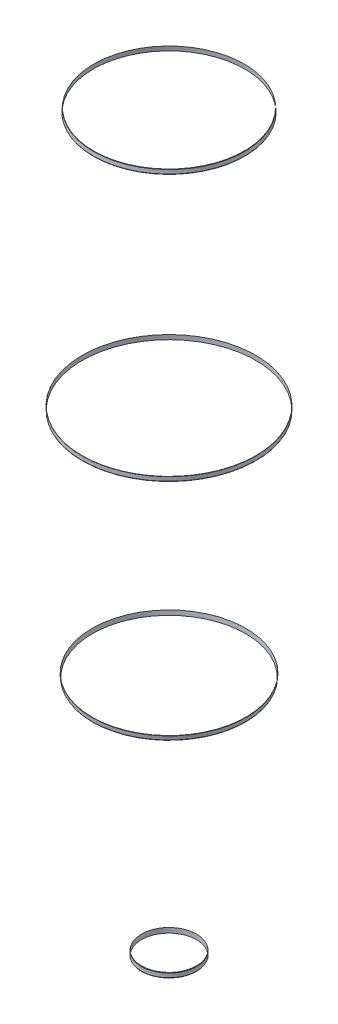
ISO-10303-21;
HEADER;
FILE_DESCRIPTION(('STEP AP214'),'2;1');
FILE_NAME('part.step','',(''),(''),'','','');
FILE_SCHEMA(('AUTOMOTIVE_DESIGN { 1 0 10303 214 1 1 1 1 }'));
ENDSEC;
DATA;
#1=APPLICATION_CONTEXT('core data for automotive mechanical design processes');
#2=APPLICATION_PROTOCOL_DEFINITION('international standard','automotive_design',2000,#1);
#3=PRODUCT_CONTEXT('',#1,'mechanical');
#4=PRODUCT('Part','Part','',(#3));
#5=PRODUCT_RELATED_PRODUCT_CATEGORY('part','',(#4));
#6=PRODUCT_DEFINITION_FORMATION('','',#4);
#7=PRODUCT_DEFINITION_CONTEXT('part definition',#1,'design');
#8=PRODUCT_DEFINITION('design','',#6,#7);
#9=PRODUCT_DEFINITION_SHAPE('','',#8);
#10=(LENGTH_UNIT() NAMED_UNIT(*) SI_UNIT(.MILLI.,.METRE.));
#11=(NAMED_UNIT(*) PLANE_ANGLE_UNIT() SI_UNIT($,.RADIAN.));
#12=(NAMED_UNIT(*) SI_UNIT($,.STERADIAN.) SOLID_ANGLE_UNIT());
#13=UNCERTAINTY_MEASURE_WITH_UNIT(LENGTH_MEASURE(1.E-05),#10,'distance_accuracy_value','');
#14=(GEOMETRIC_REPRESENTATION_CONTEXT(3) GLOBAL_UNCERTAINTY_ASSIGNED_CONTEXT((#13)) GLOBAL_UNIT_ASSIGNED_CONTEXT((#10,
#11,#12)) REPRESENTATION_CONTEXT('',''));
#15=CARTESIAN_POINT('',(0.,0.,0.));
#16=DIRECTION('',(0.,0.,1.));
#17=DIRECTION('',(1.,0.,0.));
#18=AXIS2_PLACEMENT_3D('',#15,#16,#17);
#19=CARTESIAN_POINT('',(0.,1564.70929603,0.));
#20=DIRECTION('',(0.,1.,0.));
#21=DIRECTION('',(0.,0.,1.));
#22=AXIS2_PLACEMENT_3D('',#19,#20,#21);
#23=CYLINDRICAL_SURFACE('',#22,195.47884557);
#24=CARTESIAN_POINT('',(0.,1800.72295152003,0.));
#25=DIRECTION('',(0.,1.,0.));
#26=DIRECTION('',(0.479425538604204,0.,0.877582561890372));
#27=AXIS2_PLACEMENT_3D('',#24,#25,#26);
#28=CIRCLE('',#27,195.478845570266);
#29=CARTESIAN_POINT('',(93.7175508232526,1800.72295152003,171.548826090926));
#30=VERTEX_POINT('',#29);
#31=EDGE_CURVE('P0_E26',#30,#30,#28,.F.);
#32=ORIENTED_EDGE('',*,*,#31,.F.);
#33=EDGE_LOOP('',(#32));
#34=FACE_BOUND('',#33,.T.);
#35=CARTESIAN_POINT('',(0.,1809.67374612871,0.));
#36=DIRECTION('',(0.,-1.,0.));
#37=DIRECTION('',(0.479425538604204,0.,0.877582561890373));
#38=AXIS2_PLACEMENT_3D('',#35,#36,#37);
#39=CIRCLE('',#38,195.478845567772);
#40=CARTESIAN_POINT('',(93.7175508220568,1809.67374612871,171.548826088737));
#41=VERTEX_POINT('',#40);
#42=EDGE_CURVE('P0_E17',#41,#41,#39,.F.);
#43=ORIENTED_EDGE('',*,*,#42,.F.);
#44=EDGE_LOOP('',(#43));
#45=FACE_BOUND('',#44,.T.);
#46=ADVANCED_FACE('P0_F14',(#34,#45),#23,.T.);
#47=CARTESIAN_POINT('',(0.,1809.67374612871,0.));
#48=DIRECTION('',(0.,-1.,0.));
#49=DIRECTION('',(1.,0.,0.));
#50=AXIS2_PLACEMENT_3D('',#47,#48,#49);
#51=CONICAL_SURFACE('',#50,195.478845567772,0.464025289864028);
#52=ORIENTED_EDGE('',*,*,#42,.T.);
#53=EDGE_LOOP('',(#52));
#54=FACE_BOUND('',#53,.T.);
#55=CARTESIAN_POINT('',(0.,1810.11453269,0.));
#56=DIRECTION('',(0.,1.,0.));
#57=DIRECTION('',(0.,0.,1.));
#58=AXIS2_PLACEMENT_3D('',#55,#56,#57);
#59=CIRCLE('',#58,195.258244152);
#60=CARTESIAN_POINT('',(0.,1810.11453269,195.258244152));
#61=VERTEX_POINT('',#60);
#62=EDGE_CURVE('P0_E21',#61,#61,#59,.F.);
#63=ORIENTED_EDGE('',*,*,#62,.T.);
#64=EDGE_LOOP('',(#63));
#65=FACE_BOUND('',#64,.T.);
#66=ADVANCED_FACE('P0_F34',(#54,#65),#51,.T.);
#67=CARTESIAN_POINT('',(0.,1800.72295152003,0.));
#68=DIRECTION('',(0.,1.,0.));
#69=DIRECTION('',(-1.,0.,0.));
#70=AXIS2_PLACEMENT_3D('',#67,#68,#69);
#71=CONICAL_SURFACE('',#70,195.478845570266,0.318062928618002);
#72=CARTESIAN_POINT('',(0.,1800.05292127,0.));
#73=DIRECTION('',(0.,1.,0.));
#74=DIRECTION('',(0.,0.,1.));
#75=AXIS2_PLACEMENT_3D('',#72,#73,#74);
#76=CIRCLE('',#75,195.258244152);
#77=CARTESIAN_POINT('',(0.,1800.05292127,195.258244152));
#78=VERTEX_POINT('',#77);
#79=EDGE_CURVE('P0_E10',#78,#78,#76,.T.);
#80=ORIENTED_EDGE('',*,*,#79,.T.);
#81=EDGE_LOOP('',(#80));
#82=FACE_BOUND('',#81,.T.);
#83=ORIENTED_EDGE('',*,*,#31,.T.);
#84=EDGE_LOOP('',(#83));
#85=FACE_BOUND('',#84,.T.);
#86=ADVANCED_FACE('P0_F43',(#82,#85),#71,.T.);
#87=CARTESIAN_POINT('',(0.,1564.70929603,0.));
#88=DIRECTION('',(0.,1.,0.));
#89=DIRECTION('',(0.,0.,1.));
#90=AXIS2_PLACEMENT_3D('',#87,#88,#89);
#91=CYLINDRICAL_SURFACE('',#90,195.258244152);
#92=ORIENTED_EDGE('',*,*,#62,.F.);
#93=EDGE_LOOP('',(#92));
#94=FACE_BOUND('',#93,.T.);
#95=ORIENTED_EDGE('',*,*,#79,.F.);
#96=EDGE_LOOP('',(#95));
#97=FACE_BOUND('',#96,.T.);
#98=ADVANCED_FACE('P0_F44',(#94,#97),#91,.F.);
#99=CLOSED_SHELL('',(#46,#66,#86,#98));
#100=MANIFOLD_SOLID_BREP('P0_B1',#99);
#101=CARTESIAN_POINT('',(0.,2380.71004669998,0.));
#102=DIRECTION('',(0.,-1.,0.));
#103=DIRECTION('',(0.,0.,-1.));
#104=AXIS2_PLACEMENT_3D('',#101,#102,#103);
#105=CONICAL_SURFACE('',#104,170.288715884349,0.0736089865628028);
#106=CARTESIAN_POINT('',(0.,2380.71004670009,0.));
#107=DIRECTION('',(0.,1.,0.));
#108=DIRECTION('',(0.479425538604204,0.,0.877582561890372));
#109=AXIS2_PLACEMENT_3D('',#106,#107,#108);
#110=CIRCLE('',#109,170.288715884334);
#111=CARTESIAN_POINT('',(81.6407593310648,2380.71004670009,149.442407546795));
#112=VERTEX_POINT('',#111);
#113=EDGE_CURVE('P1_E26',#112,#112,#110,.F.);
#114=ORIENTED_EDGE('',*,*,#113,.F.);
#115=EDGE_LOOP('',(#114));
#116=FACE_BOUND('',#115,.T.);
#117=CARTESIAN_POINT('',(0.,2389.1305474995,0.));
#118=DIRECTION('',(0.,-1.,0.));
#119=DIRECTION('',(0.479425538604203,0.,0.877582561890373));
#120=AXIS2_PLACEMENT_3D('',#117,#118,#119);
#121=CIRCLE('',#120,169.66776945998);
#122=CARTESIAN_POINT('',(81.3430617571246,2389.1305474995,148.897475792914));
#123=VERTEX_POINT('',#122);
#124=EDGE_CURVE('P1_E17',#123,#123,#121,.F.);
#125=ORIENTED_EDGE('',*,*,#124,.F.);
#126=EDGE_LOOP('',(#125));
#127=FACE_BOUND('',#126,.T.);
#128=ADVANCED_FACE('P1_F14',(#116,#127),#105,.T.);
#129=CARTESIAN_POINT('',(0.,2389.1305474995,0.));
#130=DIRECTION('',(0.,-1.,0.));
#131=DIRECTION('',(0.,0.,-1.));
#132=AXIS2_PLACEMENT_3D('',#129,#130,#131);
#133=CONICAL_SURFACE('',#132,169.66776945998,0.372822856065);
#134=ORIENTED_EDGE('',*,*,#124,.T.);
#135=EDGE_LOOP('',(#134));
#136=FACE_BOUND('',#135,.T.);
#137=CARTESIAN_POINT('',(0.,2390.02569629996,0.));
#138=DIRECTION('',(0.,-1.,0.));
#139=DIRECTION('',(0.479425538604203,0.,0.877582561890373));
#140=AXIS2_PLACEMENT_3D('',#137,#138,#139);
#141=CIRCLE('',#140,169.317664008003);
#142=CARTESIAN_POINT('',(81.1752122622423,2390.02569629996,148.590229353436));
#143=VERTEX_POINT('',#142);
#144=EDGE_CURVE('P1_E21',#143,#143,#141,.T.);
#145=ORIENTED_EDGE('',*,*,#144,.T.);
#146=EDGE_LOOP('',(#145));
#147=FACE_BOUND('',#146,.T.);
#148=ADVANCED_FACE('P1_F34',(#136,#147),#133,.T.);
#149=CARTESIAN_POINT('',(0.,2380.71004670009,0.));
#150=DIRECTION('',(0.,1.,0.));
#151=DIRECTION('',(0.,0.,1.));
#152=AXIS2_PLACEMENT_3D('',#149,#150,#151);
#153=CONICAL_SURFACE('',#152,170.288715884334,0.304332282663018);
#154=CARTESIAN_POINT('',(0.,2379.97752486,0.));
#155=DIRECTION('',(0.,-1.,0.));
#156=DIRECTION('',(0.479425538604203,0.,0.877582561890373));
#157=AXIS2_PLACEMENT_3D('',#154,#155,#156);
#158=CIRCLE('',#157,170.058638477933);
#159=CARTESIAN_POINT('',(81.5304543465805,2379.97752486,149.240495627053));
#160=VERTEX_POINT('',#159);
#161=EDGE_CURVE('P1_E10',#160,#160,#158,.F.);
#162=ORIENTED_EDGE('',*,*,#161,.T.);
#163=EDGE_LOOP('',(#162));
#164=FACE_BOUND('',#163,.T.);
#165=ORIENTED_EDGE('',*,*,#113,.T.);
#166=EDGE_LOOP('',(#165));
#167=FACE_BOUND('',#166,.T.);
#168=ADVANCED_FACE('P1_F43',(#164,#167),#153,.T.);
#169=CARTESIAN_POINT('',(0.,2379.97752486,0.));
#170=DIRECTION('',(0.,-1.,0.));
#171=DIRECTION('',(0.,0.,-1.));
#172=AXIS2_PLACEMENT_3D('',#169,#170,#171);
#173=CONICAL_SURFACE('',#172,170.058638477933,0.0736089865628016);
#174=ORIENTED_EDGE('',*,*,#144,.F.);
#175=EDGE_LOOP('',(#174));
#176=FACE_BOUND('',#175,.T.);
#177=ORIENTED_EDGE('',*,*,#161,.F.);
#178=EDGE_LOOP('',(#177));
#179=FACE_BOUND('',#178,.T.);
#180=ADVANCED_FACE('P1_F44',(#176,#179),#173,.F.);
#181=CLOSED_SHELL('',(#128,#148,#168,#180));
#182=MANIFOLD_SOLID_BREP('P1_B1',#181);
#183=CARTESIAN_POINT('',(0.,1564.70929603,0.));
#184=DIRECTION('',(0.,1.,0.));
#185=DIRECTION('',(0.,0.,1.));
#186=AXIS2_PLACEMENT_3D('',#183,#184,#185);
#187=CYLINDRICAL_SURFACE('',#186,62.1620782758);
#188=CARTESIAN_POINT('',(0.,740.23459434584,0.));
#189=DIRECTION('',(0.,1.,0.));
#190=DIRECTION('',(0.479425538604204,0.,0.877582561890372));
#191=AXIS2_PLACEMENT_3D('',#188,#189,#190);
#192=CIRCLE('',#191,62.1620782761676);
#193=CARTESIAN_POINT('',(29.8020878583083,740.23459434584,54.552355906029));
#194=VERTEX_POINT('',#193);
#195=EDGE_CURVE('P2_E26',#194,#194,#192,.F.);
#196=ORIENTED_EDGE('',*,*,#195,.F.);
#197=EDGE_LOOP('',(#196));
#198=FACE_BOUND('',#197,.T.);
#199=CARTESIAN_POINT('',(0.,749.108251413947,0.));
#200=DIRECTION('',(0.,-1.,0.));
#201=DIRECTION('',(0.479425538604204,0.,0.877582561890372));
#202=AXIS2_PLACEMENT_3D('',#199,#200,#201);
#203=CIRCLE('',#202,62.1620782756514);
#204=CARTESIAN_POINT('',(29.8020878580608,749.108251413947,54.552355905576));
#205=VERTEX_POINT('',#204);
#206=EDGE_CURVE('P2_E17',#205,#205,#203,.F.);
#207=ORIENTED_EDGE('',*,*,#206,.F.);
#208=EDGE_LOOP('',(#207));
#209=FACE_BOUND('',#208,.T.);
#210=ADVANCED_FACE('P2_F14',(#198,#209),#187,.T.);
#211=CARTESIAN_POINT('',(0.,749.108251413947,0.));
#212=DIRECTION('',(0.,-1.,0.));
#213=DIRECTION('',(0.,0.,-1.));
#214=AXIS2_PLACEMENT_3D('',#211,#212,#213);
#215=CONICAL_SURFACE('',#214,62.1620782756514,0.292028530966002);
#216=ORIENTED_EDGE('',*,*,#206,.T.);
#217=EDGE_LOOP('',(#216));
#218=FACE_BOUND('',#217,.T.);
#219=CARTESIAN_POINT('',(0.,750.420042309,0.));
#220=DIRECTION('',(0.,1.,0.));
#221=DIRECTION('',(0.,0.,1.));
#222=AXIS2_PLACEMENT_3D('',#219,#220,#221);
#223=CIRCLE('',#222,61.7677233682);
#224=CARTESIAN_POINT('',(0.,750.420042309,61.7677233682));
#225=VERTEX_POINT('',#224);
#226=EDGE_CURVE('P2_E21',#225,#225,#223,.F.);
#227=ORIENTED_EDGE('',*,*,#226,.T.);
#228=EDGE_LOOP('',(#227));
#229=FACE_BOUND('',#228,.T.);
#230=ADVANCED_FACE('P2_F34',(#218,#229),#215,.T.);
#231=CARTESIAN_POINT('',(0.,740.23459434584,0.));
#232=DIRECTION('',(0.,1.,0.));
#233=DIRECTION('',(0.,0.,1.));
#234=AXIS2_PLACEMENT_3D('',#231,#232,#233);
#235=CONICAL_SURFACE('',#234,62.1620782761676,0.438150200270006);
#236=CARTESIAN_POINT('',(0.,739.392895752,0.));
#237=DIRECTION('',(0.,1.,0.));
#238=DIRECTION('',(0.,0.,1.));
#239=AXIS2_PLACEMENT_3D('',#236,#237,#238);
#240=CIRCLE('',#239,61.7677233682);
#241=CARTESIAN_POINT('',(0.,739.392895752,61.7677233682));
#242=VERTEX_POINT('',#241);
#243=EDGE_CURVE('P2_E10',#242,#242,#240,.T.);
#244=ORIENTED_EDGE('',*,*,#243,.T.);
#245=EDGE_LOOP('',(#244));
#246=FACE_BOUND('',#245,.T.);
#247=ORIENTED_EDGE('',*,*,#195,.T.);
#248=EDGE_LOOP('',(#247));
#249=FACE_BOUND('',#248,.T.);
#250=ADVANCED_FACE('P2_F43',(#246,#249),#235,.T.);
#251=CARTESIAN_POINT('',(0.,1564.70929603,0.));
#252=DIRECTION('',(0.,1.,0.));
#253=DIRECTION('',(0.,0.,1.));
#254=AXIS2_PLACEMENT_3D('',#251,#252,#253);
#255=CYLINDRICAL_SURFACE('',#254,61.7677233682);
#256=ORIENTED_EDGE('',*,*,#226,.F.);
#257=EDGE_LOOP('',(#256));
#258=FACE_BOUND('',#257,.T.);
#259=ORIENTED_EDGE('',*,*,#243,.F.);
#260=EDGE_LOOP('',(#259));
#261=FACE_BOUND('',#260,.T.);
#262=ADVANCED_FACE('P2_F44',(#258,#261),#255,.F.);
#263=CLOSED_SHELL('',(#210,#230,#250,#262));
#264=MANIFOLD_SOLID_BREP('P2_B1',#263);
#265=CARTESIAN_POINT('',(0.,1289.29518328998,0.));
#266=DIRECTION('',(0.,1.,0.));
#267=DIRECTION('',(-1.,0.,0.));
#268=AXIS2_PLACEMENT_3D('',#265,#266,#267);
#269=CONICAL_SURFACE('',#268,173.185467507116,0.079922365697401);
#270=CARTESIAN_POINT('',(0.,1280.76096079908,0.));
#271=DIRECTION('',(0.,1.,0.));
#272=DIRECTION('',(0.479425538604204,0.,0.877582561890372));
#273=AXIS2_PLACEMENT_3D('',#270,#271,#272);
#274=CIRCLE('',#273,172.501936266325);
#275=CARTESIAN_POINT('',(82.7018337047509,1280.76096079908,151.384691159651));
#276=VERTEX_POINT('',#275);
#277=EDGE_CURVE('P3_E26',#276,#276,#274,.F.);
#278=ORIENTED_EDGE('',*,*,#277,.F.);
#279=EDGE_LOOP('',(#278));
#280=FACE_BOUND('',#279,.T.);
#281=CARTESIAN_POINT('',(0.,1289.29518328963,0.));
#282=DIRECTION('',(0.,-1.,0.));
#283=DIRECTION('',(0.479425538604204,0.,0.877582561890372));
#284=AXIS2_PLACEMENT_3D('',#281,#282,#283);
#285=CIRCLE('',#284,173.18546750614);
#286=CARTESIAN_POINT('',(83.0295360375519,1289.29518328963,151.98454625622));
#287=VERTEX_POINT('',#286);
#288=EDGE_CURVE('P3_E17',#287,#287,#285,.F.);
#289=ORIENTED_EDGE('',*,*,#288,.F.);
#290=EDGE_LOOP('',(#289));
#291=FACE_BOUND('',#290,.T.);
#292=ADVANCED_FACE('P3_F14',(#280,#291),#269,.T.);
#293=CARTESIAN_POINT('',(0.,1289.29518328963,0.));
#294=DIRECTION('',(0.,-1.,0.));
#295=DIRECTION('',(0.,0.,-1.));
#296=AXIS2_PLACEMENT_3D('',#293,#294,#295);
#297=CONICAL_SURFACE('',#296,173.18546750614,0.454441841703013);
#298=ORIENTED_EDGE('',*,*,#288,.T.);
#299=EDGE_LOOP('',(#298));
#300=FACE_BOUND('',#299,.T.);
#301=CARTESIAN_POINT('',(0.,1289.91194275994,0.));
#302=DIRECTION('',(0.,1.,0.));
#303=DIRECTION('',(0.479425538604204,0.,0.877582561890372));
#304=AXIS2_PLACEMENT_3D('',#301,#302,#303);
#305=CIRCLE('',#304,172.884152632733);
#306=CARTESIAN_POINT('',(82.8850779920793,1289.91194275994,151.72011757768));
#307=VERTEX_POINT('',#306);
#308=EDGE_CURVE('P3_E21',#307,#307,#305,.F.);
#309=ORIENTED_EDGE('',*,*,#308,.T.);
#310=EDGE_LOOP('',(#309));
#311=FACE_BOUND('',#310,.T.);
#312=ADVANCED_FACE('P3_F34',(#300,#311),#297,.T.);
#313=CARTESIAN_POINT('',(0.,1280.76096079908,0.));
#314=DIRECTION('',(0.,1.,0.));
#315=DIRECTION('',(-1.,0.,0.));
#316=AXIS2_PLACEMENT_3D('',#313,#314,#315);
#317=CONICAL_SURFACE('',#316,172.501936266325,0.468785224273983);
#318=CARTESIAN_POINT('',(0.,1279.93835833997,0.));
#319=DIRECTION('',(0.,1.,0.));
#320=DIRECTION('',(0.479425538604204,0.,0.877582561890373));
#321=AXIS2_PLACEMENT_3D('',#318,#319,#320);
#322=CIRCLE('',#321,172.085338615998);
#323=CARTESIAN_POINT('',(82.5021061518615,1279.93835833997,151.0190923264));
#324=VERTEX_POINT('',#323);
#325=EDGE_CURVE('P3_E10',#324,#324,#322,.T.);
#326=ORIENTED_EDGE('',*,*,#325,.T.);
#327=EDGE_LOOP('',(#326));
#328=FACE_BOUND('',#327,.T.);
#329=ORIENTED_EDGE('',*,*,#277,.T.);
#330=EDGE_LOOP('',(#329));
#331=FACE_BOUND('',#330,.T.);
#332=ADVANCED_FACE('P3_F43',(#328,#331),#317,.T.);
#333=CARTESIAN_POINT('',(0.,1289.91194275994,0.));
#334=DIRECTION('',(0.,1.,0.));
#335=DIRECTION('',(0.,0.,1.));
#336=AXIS2_PLACEMENT_3D('',#333,#334,#335);
#337=CONICAL_SURFACE('',#336,172.884152632733,0.0799223656974002);
#338=ORIENTED_EDGE('',*,*,#308,.F.);
#339=EDGE_LOOP('',(#338));
#340=FACE_BOUND('',#339,.T.);
#341=ORIENTED_EDGE('',*,*,#325,.F.);
#342=EDGE_LOOP('',(#341));
#343=FACE_BOUND('',#342,.T.);
#344=ADVANCED_FACE('P3_F44',(#340,#343),#337,.F.);
#345=CLOSED_SHELL('',(#292,#312,#332,#344));
#346=MANIFOLD_SOLID_BREP('P3_B1',#345);
#347=ADVANCED_BREP_SHAPE_REPRESENTATION('',(#18,#100,#182,#264,#346),#14);
#348=SHAPE_DEFINITION_REPRESENTATION(#9,#347);
ENDSEC;
END-ISO-10303-21;
